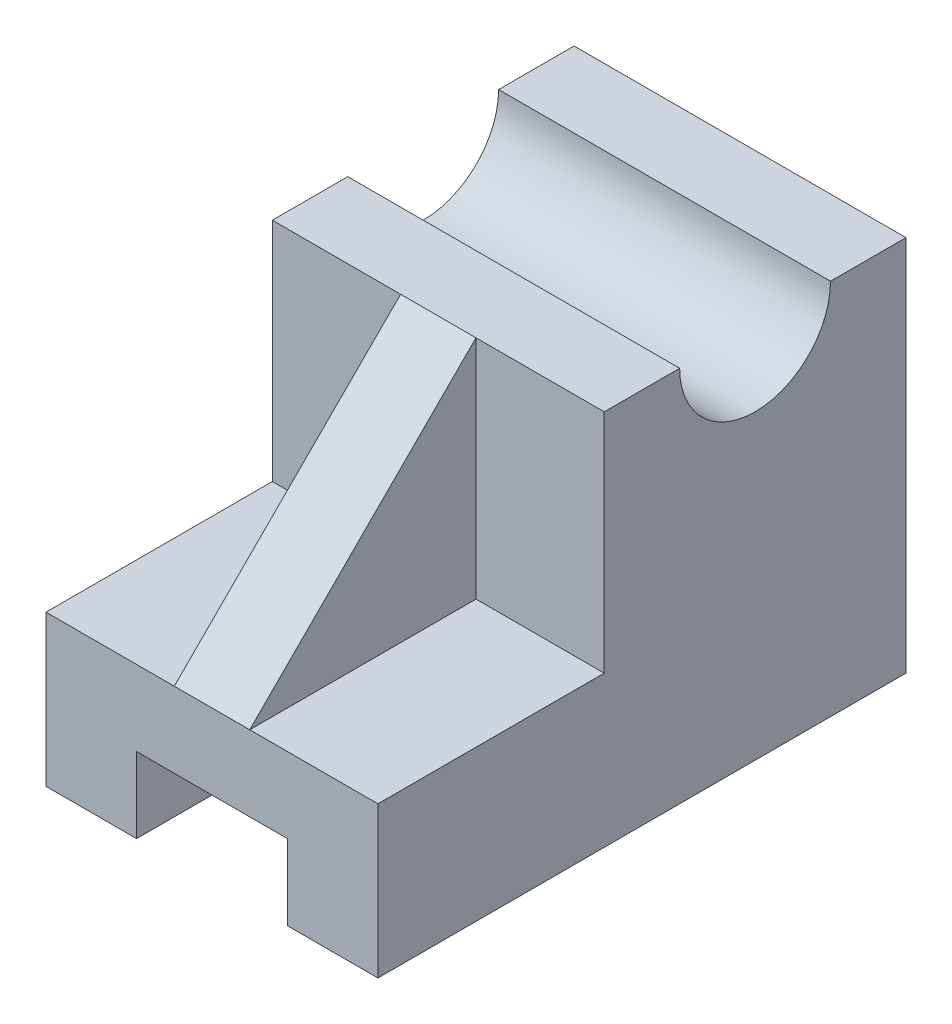
ISO-10303-21;
HEADER;
FILE_DESCRIPTION(('STEP AP214'),'2;1');
FILE_NAME('part.step','',(''),(''),'','','');
FILE_SCHEMA(('AUTOMOTIVE_DESIGN { 1 0 10303 214 1 1 1 1 }'));
ENDSEC;
DATA;
#1=APPLICATION_CONTEXT('core data for automotive mechanical design processes');
#2=APPLICATION_PROTOCOL_DEFINITION('international standard','automotive_design',2000,#1);
#3=PRODUCT_CONTEXT('',#1,'mechanical');
#4=PRODUCT('Part','Part','',(#3));
#5=PRODUCT_RELATED_PRODUCT_CATEGORY('part','',(#4));
#6=PRODUCT_DEFINITION_FORMATION('','',#4);
#7=PRODUCT_DEFINITION_CONTEXT('part definition',#1,'design');
#8=PRODUCT_DEFINITION('design','',#6,#7);
#9=PRODUCT_DEFINITION_SHAPE('','',#8);
#10=(LENGTH_UNIT() NAMED_UNIT(*) SI_UNIT(.MILLI.,.METRE.));
#11=(NAMED_UNIT(*) PLANE_ANGLE_UNIT() SI_UNIT($,.RADIAN.));
#12=(NAMED_UNIT(*) SI_UNIT($,.STERADIAN.) SOLID_ANGLE_UNIT());
#13=UNCERTAINTY_MEASURE_WITH_UNIT(LENGTH_MEASURE(1.E-05),#10,'distance_accuracy_value','');
#14=(GEOMETRIC_REPRESENTATION_CONTEXT(3) GLOBAL_UNCERTAINTY_ASSIGNED_CONTEXT((#13)) GLOBAL_UNIT_ASSIGNED_CONTEXT((#10,
#11,#12)) REPRESENTATION_CONTEXT('',''));
#15=CARTESIAN_POINT('',(0.,0.,0.));
#16=DIRECTION('',(0.,0.,1.));
#17=DIRECTION('',(1.,0.,0.));
#18=AXIS2_PLACEMENT_3D('',#15,#16,#17);
#19=CARTESIAN_POINT('',(44.,-7.00000000000001,-11.2));
#20=DIRECTION('',(0.,-1.,0.));
#21=DIRECTION('',(0.,0.,-1.));
#22=AXIS2_PLACEMENT_3D('',#19,#20,#21);
#23=PLANE('',#22);
#24=DIRECTION('',(0.,0.,1.));
#25=VECTOR('',#24,1.);
#26=CARTESIAN_POINT('',(17.,-7.00000000000001,-11.2));
#27=LINE('',#26,#25);
#28=CARTESIAN_POINT('',(17.,-7.00000000000001,-11.2));
#29=VERTEX_POINT('',#28);
#30=CARTESIAN_POINT('',(17.,-7.00000000000001,18.8));
#31=VERTEX_POINT('',#30);
#32=EDGE_CURVE('E154',#29,#31,#27,.T.);
#33=ORIENTED_EDGE('',*,*,#32,.F.);
#34=DIRECTION('',(-1.,0.,0.));
#35=VECTOR('',#34,1.);
#36=CARTESIAN_POINT('',(44.,-7.00000000000001,-11.2));
#37=LINE('',#36,#35);
#38=CARTESIAN_POINT('',(0.,-7.00000000000001,-11.2));
#39=VERTEX_POINT('',#38);
#40=EDGE_CURVE('E142',#29,#39,#37,.T.);
#41=ORIENTED_EDGE('',*,*,#40,.T.);
#42=DIRECTION('',(0.,0.,1.));
#43=VECTOR('',#42,1.);
#44=CARTESIAN_POINT('',(0.,-7.00000000000001,-11.2));
#45=LINE('',#44,#43);
#46=CARTESIAN_POINT('',(0.,-7.00000000000001,18.8));
#47=VERTEX_POINT('',#46);
#48=EDGE_CURVE('E201',#39,#47,#45,.T.);
#49=ORIENTED_EDGE('',*,*,#48,.T.);
#50=DIRECTION('',(-1.,0.,0.));
#51=VECTOR('',#50,1.);
#52=CARTESIAN_POINT('',(44.,-7.00000000000001,18.8));
#53=LINE('',#52,#51);
#54=EDGE_CURVE('E48',#31,#47,#53,.T.);
#55=ORIENTED_EDGE('',*,*,#54,.F.);
#56=EDGE_LOOP('',(#33,#41,#49,#55));
#57=FACE_BOUND('',#56,.T.);
#58=ADVANCED_FACE('F33',(#57),#23,.F.);
#59=CARTESIAN_POINT('',(44.,23.,-11.2));
#60=DIRECTION('',(0.,0.,-1.));
#61=DIRECTION('',(0.,1.,0.));
#62=AXIS2_PLACEMENT_3D('',#59,#60,#61);
#63=PLANE('',#62);
#64=DIRECTION('',(0.,-1.,0.));
#65=VECTOR('',#64,1.);
#66=CARTESIAN_POINT('',(17.,23.,-11.2));
#67=LINE('',#66,#65);
#68=CARTESIAN_POINT('',(17.,23.,-11.2));
#69=VERTEX_POINT('',#68);
#70=EDGE_CURVE('E145',#69,#29,#67,.T.);
#71=ORIENTED_EDGE('',*,*,#70,.F.);
#72=DIRECTION('',(-1.,0.,0.));
#73=VECTOR('',#72,1.);
#74=CARTESIAN_POINT('',(44.,23.,-11.2));
#75=LINE('',#74,#73);
#76=CARTESIAN_POINT('',(0.,23.,-11.2));
#77=VERTEX_POINT('',#76);
#78=EDGE_CURVE('E231',#69,#77,#75,.T.);
#79=ORIENTED_EDGE('',*,*,#78,.T.);
#80=DIRECTION('',(0.,-1.,0.));
#81=VECTOR('',#80,1.);
#82=CARTESIAN_POINT('',(0.,23.,-11.2));
#83=LINE('',#82,#81);
#84=EDGE_CURVE('E148',#77,#39,#83,.T.);
#85=ORIENTED_EDGE('',*,*,#84,.T.);
#86=ORIENTED_EDGE('',*,*,#40,.F.);
#87=EDGE_LOOP('',(#71,#79,#85,#86));
#88=FACE_BOUND('',#87,.T.);
#89=ADVANCED_FACE('F143',(#88),#63,.F.);
#90=CARTESIAN_POINT('',(44.,-27.,18.8));
#91=DIRECTION('',(0.,1.,0.));
#92=DIRECTION('',(0.,0.,1.));
#93=AXIS2_PLACEMENT_3D('',#90,#91,#92);
#94=PLANE('',#93);
#95=DIRECTION('',(-1.,0.,0.));
#96=VECTOR('',#95,1.);
#97=CARTESIAN_POINT('',(44.,-27.,18.8));
#98=LINE('',#97,#96);
#99=CARTESIAN_POINT('',(44.,-27.,18.8));
#100=VERTEX_POINT('',#99);
#101=CARTESIAN_POINT('',(32.,-27.,18.8));
#102=VERTEX_POINT('',#101);
#103=EDGE_CURVE('E243',#100,#102,#98,.T.);
#104=ORIENTED_EDGE('',*,*,#103,.T.);
#105=DIRECTION('',(0.,0.,-1.));
#106=VECTOR('',#105,1.);
#107=CARTESIAN_POINT('',(32.,-27.,18.8));
#108=LINE('',#107,#106);
#109=CARTESIAN_POINT('',(32.,-27.,-51.2));
#110=VERTEX_POINT('',#109);
#111=EDGE_CURVE('E191',#102,#110,#108,.T.);
#112=ORIENTED_EDGE('',*,*,#111,.T.);
#113=DIRECTION('',(-1.,0.,0.));
#114=VECTOR('',#113,1.);
#115=CARTESIAN_POINT('',(44.,-27.,-51.2));
#116=LINE('',#115,#114);
#117=CARTESIAN_POINT('',(44.,-27.,-51.2));
#118=VERTEX_POINT('',#117);
#119=EDGE_CURVE('E239',#118,#110,#116,.T.);
#120=ORIENTED_EDGE('',*,*,#119,.F.);
#121=DIRECTION('',(0.,0.,-1.));
#122=VECTOR('',#121,1.);
#123=CARTESIAN_POINT('',(44.,-27.,18.8));
#124=LINE('',#123,#122);
#125=EDGE_CURVE('E207',#100,#118,#124,.T.);
#126=ORIENTED_EDGE('',*,*,#125,.F.);
#127=EDGE_LOOP('',(#104,#112,#120,#126));
#128=FACE_BOUND('',#127,.T.);
#129=ADVANCED_FACE('F298',(#128),#94,.F.);
#130=CARTESIAN_POINT('',(44.,23.,-51.2));
#131=DIRECTION('',(0.,-1.,0.));
#132=DIRECTION('',(0.,0.,-1.));
#133=AXIS2_PLACEMENT_3D('',#130,#131,#132);
#134=PLANE('',#133);
#135=DIRECTION('',(-1.,0.,0.));
#136=VECTOR('',#135,1.);
#137=CARTESIAN_POINT('',(44.,23.,-51.2));
#138=LINE('',#137,#136);
#139=CARTESIAN_POINT('',(44.,23.,-51.2));
#140=VERTEX_POINT('',#139);
#141=CARTESIAN_POINT('',(0.,23.,-51.2));
#142=VERTEX_POINT('',#141);
#143=EDGE_CURVE('E235',#140,#142,#138,.T.);
#144=ORIENTED_EDGE('',*,*,#143,.T.);
#145=DIRECTION('',(0.,0.,1.));
#146=VECTOR('',#145,1.);
#147=CARTESIAN_POINT('',(0.,23.,-51.2));
#148=LINE('',#147,#146);
#149=CARTESIAN_POINT('',(0.,23.,-41.2));
#150=VERTEX_POINT('',#149);
#151=EDGE_CURVE('E227',#142,#150,#148,.T.);
#152=ORIENTED_EDGE('',*,*,#151,.T.);
#153=DIRECTION('',(1.,0.,0.));
#154=VECTOR('',#153,1.);
#155=CARTESIAN_POINT('',(0.,23.,-41.2));
#156=LINE('',#155,#154);
#157=CARTESIAN_POINT('',(44.,23.,-41.2));
#158=VERTEX_POINT('',#157);
#159=EDGE_CURVE('E199',#150,#158,#156,.T.);
#160=ORIENTED_EDGE('',*,*,#159,.T.);
#161=DIRECTION('',(0.,0.,1.));
#162=VECTOR('',#161,1.);
#163=CARTESIAN_POINT('',(44.,23.,-51.2));
#164=LINE('',#163,#162);
#165=EDGE_CURVE('E212',#140,#158,#164,.T.);
#166=ORIENTED_EDGE('',*,*,#165,.F.);
#167=EDGE_LOOP('',(#144,#152,#160,#166));
#168=FACE_BOUND('',#167,.T.);
#169=ADVANCED_FACE('F257',(#168),#134,.F.);
#170=CARTESIAN_POINT('',(44.,-7.00000000000001,-11.2));
#171=VERTEX_POINT('',#170);
#172=CARTESIAN_POINT('',(27.,-7.00000000000001,-11.2));
#173=VERTEX_POINT('',#172);
#174=EDGE_CURVE('E150',#171,#173,#37,.T.);
#175=ORIENTED_EDGE('',*,*,#174,.T.);
#176=DIRECTION('',(0.,0.,1.));
#177=VECTOR('',#176,1.);
#178=CARTESIAN_POINT('',(27.,-7.00000000000001,-11.2));
#179=LINE('',#178,#177);
#180=CARTESIAN_POINT('',(27.,-7.00000000000001,18.8));
#181=VERTEX_POINT('',#180);
#182=EDGE_CURVE('E56',#173,#181,#179,.T.);
#183=ORIENTED_EDGE('',*,*,#182,.T.);
#184=CARTESIAN_POINT('',(44.,-7.00000000000001,18.8));
#185=VERTEX_POINT('',#184);
#186=EDGE_CURVE('E246',#185,#181,#53,.T.);
#187=ORIENTED_EDGE('',*,*,#186,.F.);
#188=DIRECTION('',(0.,0.,1.));
#189=VECTOR('',#188,1.);
#190=CARTESIAN_POINT('',(44.,-7.00000000000001,-11.2));
#191=LINE('',#190,#189);
#192=EDGE_CURVE('E202',#171,#185,#191,.T.);
#193=ORIENTED_EDGE('',*,*,#192,.F.);
#194=EDGE_LOOP('',(#175,#183,#187,#193));
#195=FACE_BOUND('',#194,.T.);
#196=ADVANCED_FACE('F35',(#195),#23,.F.);
#197=CARTESIAN_POINT('',(44.,-7.00000000000001,18.8));
#198=DIRECTION('',(0.,0.,-1.));
#199=DIRECTION('',(0.,1.,0.));
#200=AXIS2_PLACEMENT_3D('',#197,#198,#199);
#201=PLANE('',#200);
#202=ORIENTED_EDGE('',*,*,#186,.T.);
#203=DIRECTION('',(1.,0.,0.));
#204=VECTOR('',#203,1.);
#205=CARTESIAN_POINT('',(44.,-7.00000000000001,18.8));
#206=LINE('',#205,#204);
#207=EDGE_CURVE('E168',#31,#181,#206,.T.);
#208=ORIENTED_EDGE('',*,*,#207,.F.);
#209=ORIENTED_EDGE('',*,*,#54,.T.);
#210=DIRECTION('',(0.,-1.,0.));
#211=VECTOR('',#210,1.);
#212=CARTESIAN_POINT('',(0.,-7.00000000000001,18.8));
#213=LINE('',#212,#211);
#214=CARTESIAN_POINT('',(0.,-27.,18.8));
#215=VERTEX_POINT('',#214);
#216=EDGE_CURVE('E217',#47,#215,#213,.T.);
#217=ORIENTED_EDGE('',*,*,#216,.T.);
#218=CARTESIAN_POINT('',(12.,-27.,18.8));
#219=VERTEX_POINT('',#218);
#220=EDGE_CURVE('E242',#219,#215,#98,.T.);
#221=ORIENTED_EDGE('',*,*,#220,.F.);
#222=DIRECTION('',(0.,-1.,0.));
#223=VECTOR('',#222,1.);
#224=CARTESIAN_POINT('',(12.,-37.,18.8));
#225=LINE('',#224,#223);
#226=CARTESIAN_POINT('',(12.,-17.,18.8));
#227=VERTEX_POINT('',#226);
#228=EDGE_CURVE('E175',#227,#219,#225,.T.);
#229=ORIENTED_EDGE('',*,*,#228,.F.);
#230=DIRECTION('',(-1.,0.,0.));
#231=VECTOR('',#230,1.);
#232=CARTESIAN_POINT('',(12.,-17.,18.8));
#233=LINE('',#232,#231);
#234=CARTESIAN_POINT('',(32.,-17.,18.8));
#235=VERTEX_POINT('',#234);
#236=EDGE_CURVE('E180',#235,#227,#233,.T.);
#237=ORIENTED_EDGE('',*,*,#236,.F.);
#238=DIRECTION('',(0.,1.,0.));
#239=VECTOR('',#238,1.);
#240=CARTESIAN_POINT('',(32.,-37.,18.8));
#241=LINE('',#240,#239);
#242=EDGE_CURVE('E171',#102,#235,#241,.T.);
#243=ORIENTED_EDGE('',*,*,#242,.F.);
#244=ORIENTED_EDGE('',*,*,#103,.F.);
#245=DIRECTION('',(0.,-1.,0.));
#246=VECTOR('',#245,1.);
#247=CARTESIAN_POINT('',(44.,-7.00000000000001,18.8));
#248=LINE('',#247,#246);
#249=EDGE_CURVE('E205',#185,#100,#248,.T.);
#250=ORIENTED_EDGE('',*,*,#249,.F.);
#251=EDGE_LOOP('',(#202,#208,#209,#217,#221,#229,#237,#243,#244,#250));
#252=FACE_BOUND('',#251,.T.);
#253=ADVANCED_FACE('F271',(#252),#201,.F.);
#254=CARTESIAN_POINT('',(12.,-27.,-51.2));
#255=VERTEX_POINT('',#254);
#256=CARTESIAN_POINT('',(0.,-27.,-51.2));
#257=VERTEX_POINT('',#256);
#258=EDGE_CURVE('E238',#255,#257,#116,.T.);
#259=ORIENTED_EDGE('',*,*,#258,.F.);
#260=DIRECTION('',(0.,0.,1.));
#261=VECTOR('',#260,1.);
#262=CARTESIAN_POINT('',(12.,-27.,18.8));
#263=LINE('',#262,#261);
#264=EDGE_CURVE('E186',#255,#219,#263,.T.);
#265=ORIENTED_EDGE('',*,*,#264,.T.);
#266=ORIENTED_EDGE('',*,*,#220,.T.);
#267=DIRECTION('',(0.,0.,-1.));
#268=VECTOR('',#267,1.);
#269=CARTESIAN_POINT('',(0.,-27.,18.8));
#270=LINE('',#269,#268);
#271=EDGE_CURVE('E220',#215,#257,#270,.T.);
#272=ORIENTED_EDGE('',*,*,#271,.T.);
#273=EDGE_LOOP('',(#259,#265,#266,#272));
#274=FACE_BOUND('',#273,.T.);
#275=ADVANCED_FACE('F267',(#274),#94,.F.);
#276=CARTESIAN_POINT('',(44.,-27.,-51.2));
#277=DIRECTION('',(0.,0.,1.));
#278=DIRECTION('',(1.,0.,0.));
#279=AXIS2_PLACEMENT_3D('',#276,#277,#278);
#280=PLANE('',#279);
#281=DIRECTION('',(-1.,0.,0.));
#282=VECTOR('',#281,1.);
#283=CARTESIAN_POINT('',(12.,-17.,-51.2));
#284=LINE('',#283,#282);
#285=CARTESIAN_POINT('',(32.,-17.,-51.2));
#286=VERTEX_POINT('',#285);
#287=CARTESIAN_POINT('',(12.,-17.,-51.2));
#288=VERTEX_POINT('',#287);
#289=EDGE_CURVE('E172',#286,#288,#284,.T.);
#290=ORIENTED_EDGE('',*,*,#289,.T.);
#291=DIRECTION('',(0.,-1.,0.));
#292=VECTOR('',#291,1.);
#293=CARTESIAN_POINT('',(12.,-37.,-51.2));
#294=LINE('',#293,#292);
#295=EDGE_CURVE('E174',#288,#255,#294,.T.);
#296=ORIENTED_EDGE('',*,*,#295,.T.);
#297=ORIENTED_EDGE('',*,*,#258,.T.);
#298=DIRECTION('',(0.,1.,0.));
#299=VECTOR('',#298,1.);
#300=CARTESIAN_POINT('',(0.,-27.,-51.2));
#301=LINE('',#300,#299);
#302=EDGE_CURVE('E223',#257,#142,#301,.T.);
#303=ORIENTED_EDGE('',*,*,#302,.T.);
#304=ORIENTED_EDGE('',*,*,#143,.F.);
#305=DIRECTION('',(0.,1.,0.));
#306=VECTOR('',#305,1.);
#307=CARTESIAN_POINT('',(44.,-27.,-51.2));
#308=LINE('',#307,#306);
#309=EDGE_CURVE('E209',#118,#140,#308,.T.);
#310=ORIENTED_EDGE('',*,*,#309,.F.);
#311=ORIENTED_EDGE('',*,*,#119,.T.);
#312=DIRECTION('',(0.,1.,0.));
#313=VECTOR('',#312,1.);
#314=CARTESIAN_POINT('',(32.,-27.,-51.2));
#315=LINE('',#314,#313);
#316=EDGE_CURVE('E11',#110,#286,#315,.T.);
#317=ORIENTED_EDGE('',*,*,#316,.T.);
#318=EDGE_LOOP('',(#290,#296,#297,#303,#304,#310,#311,#317));
#319=FACE_BOUND('',#318,.T.);
#320=ADVANCED_FACE('F262',(#319),#280,.F.);
#321=DIRECTION('',(1.,0.,0.));
#322=VECTOR('',#321,1.);
#323=CARTESIAN_POINT('',(0.,23.,-21.2));
#324=LINE('',#323,#322);
#325=CARTESIAN_POINT('',(44.,23.,-21.2));
#326=VERTEX_POINT('',#325);
#327=CARTESIAN_POINT('',(0.,23.,-21.2));
#328=VERTEX_POINT('',#327);
#329=EDGE_CURVE('E197',#326,#328,#324,.F.);
#330=ORIENTED_EDGE('',*,*,#329,.T.);
#331=EDGE_CURVE('E226',#328,#77,#148,.T.);
#332=ORIENTED_EDGE('',*,*,#331,.T.);
#333=ORIENTED_EDGE('',*,*,#78,.F.);
#334=CARTESIAN_POINT('',(27.,23.,-11.2));
#335=VERTEX_POINT('',#334);
#336=EDGE_CURVE('E236',#335,#69,#75,.T.);
#337=ORIENTED_EDGE('',*,*,#336,.F.);
#338=CARTESIAN_POINT('',(44.,23.,-11.2));
#339=VERTEX_POINT('',#338);
#340=EDGE_CURVE('E232',#339,#335,#75,.T.);
#341=ORIENTED_EDGE('',*,*,#340,.F.);
#342=EDGE_CURVE('E211',#326,#339,#164,.T.);
#343=ORIENTED_EDGE('',*,*,#342,.F.);
#344=EDGE_LOOP('',(#330,#332,#333,#337,#341,#343));
#345=FACE_BOUND('',#344,.T.);
#346=ADVANCED_FACE('F293',(#345),#134,.F.);
#347=ORIENTED_EDGE('',*,*,#340,.T.);
#348=DIRECTION('',(0.,-1.,0.));
#349=VECTOR('',#348,1.);
#350=CARTESIAN_POINT('',(27.,23.,-11.2));
#351=LINE('',#350,#349);
#352=EDGE_CURVE('E163',#335,#173,#351,.T.);
#353=ORIENTED_EDGE('',*,*,#352,.T.);
#354=ORIENTED_EDGE('',*,*,#174,.F.);
#355=DIRECTION('',(0.,-1.,0.));
#356=VECTOR('',#355,1.);
#357=CARTESIAN_POINT('',(44.,23.,-11.2));
#358=LINE('',#357,#356);
#359=EDGE_CURVE('E151',#339,#171,#358,.T.);
#360=ORIENTED_EDGE('',*,*,#359,.F.);
#361=EDGE_LOOP('',(#347,#353,#354,#360));
#362=FACE_BOUND('',#361,.T.);
#363=ADVANCED_FACE('F283',(#362),#63,.F.);
#364=CARTESIAN_POINT('',(44.,0.,0.));
#365=DIRECTION('',(1.,0.,0.));
#366=DIRECTION('',(0.,0.,-1.));
#367=AXIS2_PLACEMENT_3D('',#364,#365,#366);
#368=PLANE('',#367);
#369=CARTESIAN_POINT('',(44.,23.,-31.2));
#370=DIRECTION('',(1.,0.,0.));
#371=DIRECTION('',(0.,0.,-1.));
#372=AXIS2_PLACEMENT_3D('',#369,#370,#371);
#373=CIRCLE('',#372,10.);
#374=EDGE_CURVE('E194',#326,#158,#373,.T.);
#375=ORIENTED_EDGE('',*,*,#374,.F.);
#376=ORIENTED_EDGE('',*,*,#342,.T.);
#377=ORIENTED_EDGE('',*,*,#359,.T.);
#378=ORIENTED_EDGE('',*,*,#192,.T.);
#379=ORIENTED_EDGE('',*,*,#249,.T.);
#380=ORIENTED_EDGE('',*,*,#125,.T.);
#381=ORIENTED_EDGE('',*,*,#309,.T.);
#382=ORIENTED_EDGE('',*,*,#165,.T.);
#383=EDGE_LOOP('',(#375,#376,#377,#378,#379,#380,#381,#382));
#384=FACE_BOUND('',#383,.T.);
#385=ADVANCED_FACE('F289',(#384),#368,.T.);
#386=CARTESIAN_POINT('',(0.,0.,0.));
#387=DIRECTION('',(1.,0.,0.));
#388=DIRECTION('',(0.,0.,-1.));
#389=AXIS2_PLACEMENT_3D('',#386,#387,#388);
#390=PLANE('',#389);
#391=ORIENTED_EDGE('',*,*,#331,.F.);
#392=CARTESIAN_POINT('',(0.,23.,-31.2));
#393=DIRECTION('',(1.,0.,0.));
#394=DIRECTION('',(0.,0.,-1.));
#395=AXIS2_PLACEMENT_3D('',#392,#393,#394);
#396=CIRCLE('',#395,10.);
#397=EDGE_CURVE('E41',#328,#150,#396,.T.);
#398=ORIENTED_EDGE('',*,*,#397,.T.);
#399=ORIENTED_EDGE('',*,*,#151,.F.);
#400=ORIENTED_EDGE('',*,*,#302,.F.);
#401=ORIENTED_EDGE('',*,*,#271,.F.);
#402=ORIENTED_EDGE('',*,*,#216,.F.);
#403=ORIENTED_EDGE('',*,*,#48,.F.);
#404=ORIENTED_EDGE('',*,*,#84,.F.);
#405=EDGE_LOOP('',(#391,#398,#399,#400,#401,#402,#403,#404));
#406=FACE_BOUND('',#405,.T.);
#407=ADVANCED_FACE('F252',(#406),#390,.F.);
#408=CARTESIAN_POINT('',(0.,23.,-31.2));
#409=DIRECTION('',(1.,0.,0.));
#410=DIRECTION('',(0.,0.,-1.));
#411=AXIS2_PLACEMENT_3D('',#408,#409,#410);
#412=CYLINDRICAL_SURFACE('',#411,10.);
#413=ORIENTED_EDGE('',*,*,#374,.T.);
#414=ORIENTED_EDGE('',*,*,#159,.F.);
#415=ORIENTED_EDGE('',*,*,#397,.F.);
#416=ORIENTED_EDGE('',*,*,#329,.F.);
#417=EDGE_LOOP('',(#413,#414,#415,#416));
#418=FACE_BOUND('',#417,.T.);
#419=ADVANCED_FACE('F294',(#418),#412,.F.);
#420=CARTESIAN_POINT('',(32.,-37.,-51.2));
#421=DIRECTION('',(1.,0.,0.));
#422=DIRECTION('',(0.,0.,-1.));
#423=AXIS2_PLACEMENT_3D('',#420,#421,#422);
#424=PLANE('',#423);
#425=ORIENTED_EDGE('',*,*,#242,.T.);
#426=DIRECTION('',(0.,0.,1.));
#427=VECTOR('',#426,1.);
#428=CARTESIAN_POINT('',(32.,-17.,-51.2));
#429=LINE('',#428,#427);
#430=EDGE_CURVE('E178',#286,#235,#429,.T.);
#431=ORIENTED_EDGE('',*,*,#430,.F.);
#432=ORIENTED_EDGE('',*,*,#316,.F.);
#433=ORIENTED_EDGE('',*,*,#111,.F.);
#434=EDGE_LOOP('',(#425,#431,#432,#433));
#435=FACE_BOUND('',#434,.T.);
#436=ADVANCED_FACE('F301',(#435),#424,.F.);
#437=CARTESIAN_POINT('',(12.,-37.,-51.2));
#438=DIRECTION('',(-1.,0.,0.));
#439=DIRECTION('',(0.,0.,1.));
#440=AXIS2_PLACEMENT_3D('',#437,#438,#439);
#441=PLANE('',#440);
#442=ORIENTED_EDGE('',*,*,#295,.F.);
#443=DIRECTION('',(0.,0.,1.));
#444=VECTOR('',#443,1.);
#445=CARTESIAN_POINT('',(12.,-17.,-51.2));
#446=LINE('',#445,#444);
#447=EDGE_CURVE('E183',#288,#227,#446,.T.);
#448=ORIENTED_EDGE('',*,*,#447,.T.);
#449=ORIENTED_EDGE('',*,*,#228,.T.);
#450=ORIENTED_EDGE('',*,*,#264,.F.);
#451=EDGE_LOOP('',(#442,#448,#449,#450));
#452=FACE_BOUND('',#451,.T.);
#453=ADVANCED_FACE('F309',(#452),#441,.F.);
#454=CARTESIAN_POINT('',(12.,-17.,-51.2));
#455=DIRECTION('',(0.,1.,0.));
#456=DIRECTION('',(0.,0.,1.));
#457=AXIS2_PLACEMENT_3D('',#454,#455,#456);
#458=PLANE('',#457);
#459=ORIENTED_EDGE('',*,*,#236,.T.);
#460=ORIENTED_EDGE('',*,*,#447,.F.);
#461=ORIENTED_EDGE('',*,*,#289,.F.);
#462=ORIENTED_EDGE('',*,*,#430,.T.);
#463=EDGE_LOOP('',(#459,#460,#461,#462));
#464=FACE_BOUND('',#463,.T.);
#465=ADVANCED_FACE('F305',(#464),#458,.F.);
#466=CARTESIAN_POINT('',(22.,23.,-11.2));
#467=DIRECTION('',(0.,0.707106781186548,0.707106781186547));
#468=DIRECTION('',(0.,-0.707106781186547,0.707106781186548));
#469=AXIS2_PLACEMENT_3D('',#466,#467,#468);
#470=PLANE('',#469);
#471=DIRECTION('',(0.,-0.707106781186547,0.707106781186548));
#472=VECTOR('',#471,1.);
#473=CARTESIAN_POINT('',(17.,23.,-11.2));
#474=LINE('',#473,#472);
#475=EDGE_CURVE('E161',#69,#31,#474,.T.);
#476=ORIENTED_EDGE('',*,*,#475,.T.);
#477=ORIENTED_EDGE('',*,*,#207,.T.);
#478=DIRECTION('',(0.,-0.707106781186547,0.707106781186548));
#479=VECTOR('',#478,1.);
#480=CARTESIAN_POINT('',(27.,23.,-11.2));
#481=LINE('',#480,#479);
#482=EDGE_CURVE('E158',#335,#181,#481,.T.);
#483=ORIENTED_EDGE('',*,*,#482,.F.);
#484=ORIENTED_EDGE('',*,*,#336,.T.);
#485=EDGE_LOOP('',(#476,#477,#483,#484));
#486=FACE_BOUND('',#485,.T.);
#487=ADVANCED_FACE('F275',(#486),#470,.T.);
#488=CARTESIAN_POINT('',(27.,-2.00000000000001,-16.2));
#489=DIRECTION('',(1.,0.,0.));
#490=DIRECTION('',(0.,0.,-1.));
#491=AXIS2_PLACEMENT_3D('',#488,#489,#490);
#492=PLANE('',#491);
#493=ORIENTED_EDGE('',*,*,#352,.F.);
#494=ORIENTED_EDGE('',*,*,#482,.T.);
#495=ORIENTED_EDGE('',*,*,#182,.F.);
#496=EDGE_LOOP('',(#493,#494,#495));
#497=FACE_BOUND('',#496,.T.);
#498=ADVANCED_FACE('F279',(#497),#492,.T.);
#499=CARTESIAN_POINT('',(17.,-2.00000000000001,-16.2));
#500=DIRECTION('',(1.,0.,0.));
#501=DIRECTION('',(0.,0.,-1.));
#502=AXIS2_PLACEMENT_3D('',#499,#500,#501);
#503=PLANE('',#502);
#504=ORIENTED_EDGE('',*,*,#475,.F.);
#505=ORIENTED_EDGE('',*,*,#70,.T.);
#506=ORIENTED_EDGE('',*,*,#32,.T.);
#507=EDGE_LOOP('',(#504,#505,#506));
#508=FACE_BOUND('',#507,.T.);
#509=ADVANCED_FACE('F160',(#508),#503,.F.);
#510=CLOSED_SHELL('',(#58,#89,#129,#169,#196,#253,#275,#320,#346,#363,#385,#407,#419,#436,#453,
#465,#487,#498,#509));
#511=MANIFOLD_SOLID_BREP('B2',#510);
#512=ADVANCED_BREP_SHAPE_REPRESENTATION('',(#18,#511),#14);
#513=SHAPE_DEFINITION_REPRESENTATION(#9,#512);
ENDSEC;
END-ISO-10303-21;
